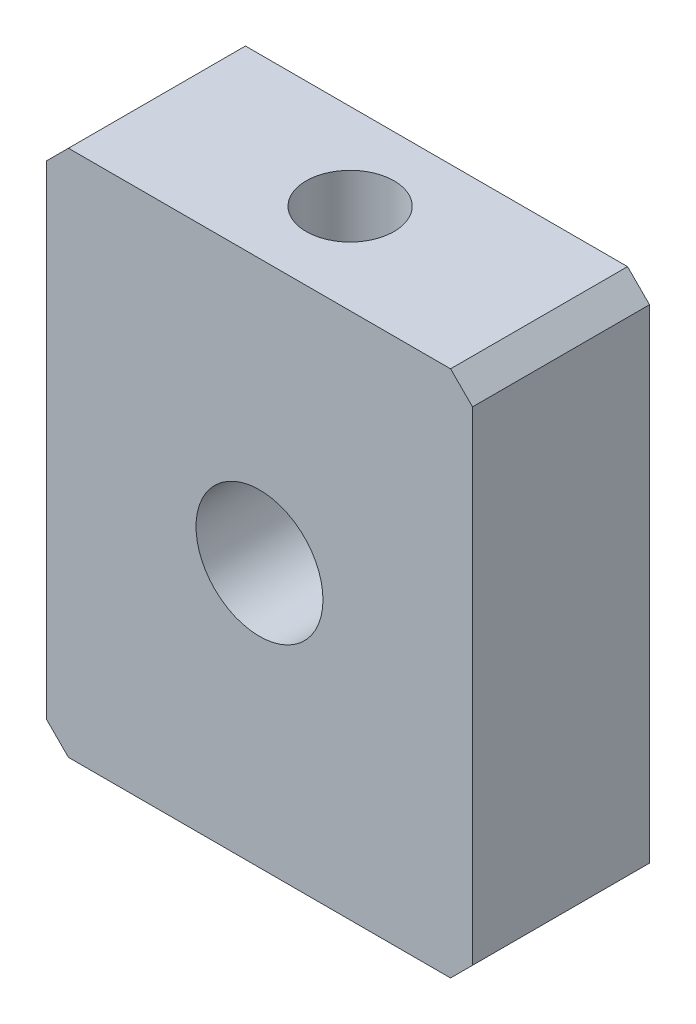
ISO-10303-21;
HEADER;
FILE_DESCRIPTION(('STEP AP214'),'2;1');
FILE_NAME('part.step','',(''),(''),'','','');
FILE_SCHEMA(('AUTOMOTIVE_DESIGN { 1 0 10303 214 1 1 1 1 }'));
ENDSEC;
DATA;
#1=APPLICATION_CONTEXT('core data for automotive mechanical design processes');
#2=APPLICATION_PROTOCOL_DEFINITION('international standard','automotive_design',2000,#1);
#3=PRODUCT_CONTEXT('',#1,'mechanical');
#4=PRODUCT('Part','Part','',(#3));
#5=PRODUCT_RELATED_PRODUCT_CATEGORY('part','',(#4));
#6=PRODUCT_DEFINITION_FORMATION('','',#4);
#7=PRODUCT_DEFINITION_CONTEXT('part definition',#1,'design');
#8=PRODUCT_DEFINITION('design','',#6,#7);
#9=PRODUCT_DEFINITION_SHAPE('','',#8);
#10=(LENGTH_UNIT() NAMED_UNIT(*) SI_UNIT(.MILLI.,.METRE.));
#11=(NAMED_UNIT(*) PLANE_ANGLE_UNIT() SI_UNIT($,.RADIAN.));
#12=(NAMED_UNIT(*) SI_UNIT($,.STERADIAN.) SOLID_ANGLE_UNIT());
#13=UNCERTAINTY_MEASURE_WITH_UNIT(LENGTH_MEASURE(1.E-05),#10,'distance_accuracy_value','');
#14=(GEOMETRIC_REPRESENTATION_CONTEXT(3) GLOBAL_UNCERTAINTY_ASSIGNED_CONTEXT((#13)) GLOBAL_UNIT_ASSIGNED_CONTEXT((#10,
#11,#12)) REPRESENTATION_CONTEXT('',''));
#15=CARTESIAN_POINT('',(0.,0.,0.));
#16=DIRECTION('',(0.,0.,1.));
#17=DIRECTION('',(1.,0.,0.));
#18=AXIS2_PLACEMENT_3D('',#15,#16,#17);
#19=CARTESIAN_POINT('',(164.507410621426,269.013850940292,11.8050675506658));
#20=DIRECTION('',(0.,0.,-1.));
#21=DIRECTION('',(-1.,0.,0.));
#22=AXIS2_PLACEMENT_3D('',#19,#20,#21);
#23=PLANE('',#22);
#24=CARTESIAN_POINT('',(-417.804133345049,371.961966113865,11.8050675506658));
#25=DIRECTION('',(0.,0.,-1.));
#26=DIRECTION('',(-1.,0.,0.));
#27=AXIS2_PLACEMENT_3D('',#24,#25,#26);
#28=CIRCLE('',#27,14.4381275614819);
#29=CARTESIAN_POINT('',(-432.242260906531,371.961966113865,11.8050675506658));
#30=VERTEX_POINT('',#29);
#31=EDGE_CURVE('E248',#30,#30,#28,.T.);
#32=ORIENTED_EDGE('',*,*,#31,.F.);
#33=EDGE_LOOP('',(#32));
#34=FACE_BOUND('',#33,.T.);
#35=DIRECTION('',(1.,0.,0.));
#36=VECTOR('',#35,1.);
#37=CARTESIAN_POINT('',(-466.259133345049,311.961966113865,11.8050675506658));
#38=LINE('',#37,#36);
#39=CARTESIAN_POINT('',(-461.259133345049,311.961966113865,11.8050675506658));
#40=VERTEX_POINT('',#39);
#41=CARTESIAN_POINT('',(-374.349133345049,311.961966113865,11.8050675506658));
#42=VERTEX_POINT('',#41);
#43=EDGE_CURVE('E154',#40,#42,#38,.T.);
#44=ORIENTED_EDGE('',*,*,#43,.F.);
#45=DIRECTION('',(0.707106781186548,-0.707106781186548,0.));
#46=VECTOR('',#45,1.);
#47=CARTESIAN_POINT('',(-126.901803775025,-22.3953634561591,11.8050675506658));
#48=LINE('',#47,#46);
#49=CARTESIAN_POINT('',(-466.259133345049,316.961966113865,11.8050675506658));
#50=VERTEX_POINT('',#49);
#51=EDGE_CURVE('E125',#40,#50,#48,.F.);
#52=ORIENTED_EDGE('',*,*,#51,.T.);
#53=DIRECTION('',(0.,-1.,0.));
#54=VECTOR('',#53,1.);
#55=CARTESIAN_POINT('',(-466.259133345049,311.961966113865,11.8050675506658));
#56=LINE('',#55,#54);
#57=CARTESIAN_POINT('',(-466.259133345049,426.961966113865,11.8050675506658));
#58=VERTEX_POINT('',#57);
#59=EDGE_CURVE('E113',#58,#50,#56,.T.);
#60=ORIENTED_EDGE('',*,*,#59,.F.);
#61=DIRECTION('',(-0.707106781186548,-0.707106781186548,0.));
#62=VECTOR('',#61,1.);
#63=CARTESIAN_POINT('',(-229.849918948598,663.371180510316,11.8050675506658));
#64=LINE('',#63,#62);
#65=CARTESIAN_POINT('',(-461.259133345049,431.961966113865,11.8050675506658));
#66=VERTEX_POINT('',#65);
#67=EDGE_CURVE('E122',#58,#66,#64,.F.);
#68=ORIENTED_EDGE('',*,*,#67,.T.);
#69=DIRECTION('',(-1.,0.,0.));
#70=VECTOR('',#69,1.);
#71=CARTESIAN_POINT('',(-466.259133345049,431.961966113865,11.8050675506658));
#72=LINE('',#71,#70);
#73=CARTESIAN_POINT('',(-374.349133345049,431.961966113865,11.8050675506658));
#74=VERTEX_POINT('',#73);
#75=EDGE_CURVE('E126',#74,#66,#72,.T.);
#76=ORIENTED_EDGE('',*,*,#75,.F.);
#77=DIRECTION('',(-0.707106781186548,0.707106781186548,0.));
#78=VECTOR('',#77,1.);
#79=CARTESIAN_POINT('',(-23.4468037750251,81.0596365438408,11.8050675506658));
#80=LINE('',#79,#78);
#81=CARTESIAN_POINT('',(-369.349133345049,426.961966113865,11.8050675506658));
#82=VERTEX_POINT('',#81);
#83=EDGE_CURVE('E57',#74,#82,#80,.F.);
#84=ORIENTED_EDGE('',*,*,#83,.T.);
#85=DIRECTION('',(0.,1.,0.));
#86=VECTOR('',#85,1.);
#87=CARTESIAN_POINT('',(-369.349133345049,311.961966113865,11.8050675506658));
#88=LINE('',#87,#86);
#89=CARTESIAN_POINT('',(-369.349133345049,316.961966113865,11.8050675506658));
#90=VERTEX_POINT('',#89);
#91=EDGE_CURVE('E158',#90,#82,#88,.T.);
#92=ORIENTED_EDGE('',*,*,#91,.F.);
#93=DIRECTION('',(0.707106781186548,0.707106781186548,0.));
#94=VECTOR('',#93,1.);
#95=CARTESIAN_POINT('',(-126.394918948598,559.916180510316,11.8050675506658));
#96=LINE('',#95,#94);
#97=EDGE_CURVE('E132',#90,#42,#96,.F.);
#98=ORIENTED_EDGE('',*,*,#97,.T.);
#99=EDGE_LOOP('',(#44,#52,#60,#68,#76,#84,#92,#98));
#100=FACE_BOUND('',#99,.T.);
#101=ADVANCED_FACE('F41',(#34,#100),#23,.T.);
#102=CARTESIAN_POINT('',(0.,0.,52.0650675506658));
#103=DIRECTION('',(0.,0.,-1.));
#104=DIRECTION('',(-1.,0.,0.));
#105=AXIS2_PLACEMENT_3D('',#102,#103,#104);
#106=PLANE('',#105);
#107=CARTESIAN_POINT('',(-417.804133345049,371.961966113865,52.0650675506658));
#108=DIRECTION('',(0.,0.,1.));
#109=DIRECTION('',(1.,0.,0.));
#110=AXIS2_PLACEMENT_3D('',#107,#108,#109);
#111=CIRCLE('',#110,14.4381275614819);
#112=CARTESIAN_POINT('',(-403.366005783567,371.961966113865,52.0650675506658));
#113=VERTEX_POINT('',#112);
#114=EDGE_CURVE('E251',#113,#113,#111,.T.);
#115=ORIENTED_EDGE('',*,*,#114,.F.);
#116=EDGE_LOOP('',(#115));
#117=FACE_BOUND('',#116,.T.);
#118=DIRECTION('',(0.,-1.,0.));
#119=VECTOR('',#118,1.);
#120=CARTESIAN_POINT('',(-466.259133345049,311.961966113865,52.0650675506658));
#121=LINE('',#120,#119);
#122=CARTESIAN_POINT('',(-466.259133345049,426.961966113865,52.0650675506658));
#123=VERTEX_POINT('',#122);
#124=CARTESIAN_POINT('',(-466.259133345049,316.961966113865,52.0650675506658));
#125=VERTEX_POINT('',#124);
#126=EDGE_CURVE('E116',#123,#125,#121,.T.);
#127=ORIENTED_EDGE('',*,*,#126,.T.);
#128=DIRECTION('',(-0.707106781186548,0.707106781186548,0.));
#129=VECTOR('',#128,1.);
#130=CARTESIAN_POINT('',(-466.259133345049,316.961966113865,52.0650675506658));
#131=LINE('',#130,#129);
#132=CARTESIAN_POINT('',(-461.259133345049,311.961966113865,52.0650675506658));
#133=VERTEX_POINT('',#132);
#134=EDGE_CURVE('E179',#125,#133,#131,.F.);
#135=ORIENTED_EDGE('',*,*,#134,.T.);
#136=DIRECTION('',(1.,0.,0.));
#137=VECTOR('',#136,1.);
#138=CARTESIAN_POINT('',(-466.259133345049,311.961966113865,52.0650675506658));
#139=LINE('',#138,#137);
#140=CARTESIAN_POINT('',(-374.349133345049,311.961966113865,52.0650675506658));
#141=VERTEX_POINT('',#140);
#142=EDGE_CURVE('E160',#133,#141,#139,.T.);
#143=ORIENTED_EDGE('',*,*,#142,.T.);
#144=DIRECTION('',(-0.707106781186548,-0.707106781186548,0.));
#145=VECTOR('',#144,1.);
#146=CARTESIAN_POINT('',(-374.349133345049,311.961966113865,52.0650675506658));
#147=LINE('',#146,#145);
#148=CARTESIAN_POINT('',(-369.349133345049,316.961966113865,52.0650675506658));
#149=VERTEX_POINT('',#148);
#150=EDGE_CURVE('E177',#141,#149,#147,.F.);
#151=ORIENTED_EDGE('',*,*,#150,.T.);
#152=DIRECTION('',(0.,1.,0.));
#153=VECTOR('',#152,1.);
#154=CARTESIAN_POINT('',(-369.349133345049,311.961966113865,52.0650675506658));
#155=LINE('',#154,#153);
#156=CARTESIAN_POINT('',(-369.349133345049,426.961966113865,52.0650675506658));
#157=VERTEX_POINT('',#156);
#158=EDGE_CURVE('E155',#149,#157,#155,.T.);
#159=ORIENTED_EDGE('',*,*,#158,.T.);
#160=DIRECTION('',(0.707106781186548,-0.707106781186548,0.));
#161=VECTOR('',#160,1.);
#162=CARTESIAN_POINT('',(-369.349133345049,426.961966113865,52.0650675506658));
#163=LINE('',#162,#161);
#164=CARTESIAN_POINT('',(-374.349133345049,431.961966113865,52.0650675506658));
#165=VERTEX_POINT('',#164);
#166=EDGE_CURVE('E153',#157,#165,#163,.F.);
#167=ORIENTED_EDGE('',*,*,#166,.T.);
#168=DIRECTION('',(-1.,0.,0.));
#169=VECTOR('',#168,1.);
#170=CARTESIAN_POINT('',(-466.259133345049,431.961966113865,52.0650675506658));
#171=LINE('',#170,#169);
#172=CARTESIAN_POINT('',(-461.259133345049,431.961966113865,52.0650675506658));
#173=VERTEX_POINT('',#172);
#174=EDGE_CURVE('E147',#165,#173,#171,.T.);
#175=ORIENTED_EDGE('',*,*,#174,.T.);
#176=DIRECTION('',(0.707106781186548,0.707106781186548,0.));
#177=VECTOR('',#176,1.);
#178=CARTESIAN_POINT('',(-461.259133345049,431.961966113865,52.0650675506658));
#179=LINE('',#178,#177);
#180=EDGE_CURVE('E151',#173,#123,#179,.F.);
#181=ORIENTED_EDGE('',*,*,#180,.T.);
#182=EDGE_LOOP('',(#127,#135,#143,#151,#159,#167,#175,#181));
#183=FACE_BOUND('',#182,.T.);
#184=ADVANCED_FACE('F150',(#117,#183),#106,.F.);
#185=CARTESIAN_POINT('',(-466.259133345049,311.961966113865,-142.44002345712));
#186=DIRECTION('',(0.,-1.,0.));
#187=DIRECTION('',(0.,0.,-1.));
#188=AXIS2_PLACEMENT_3D('',#185,#186,#187);
#189=PLANE('',#188);
#190=ORIENTED_EDGE('',*,*,#142,.F.);
#191=DIRECTION('',(0.,0.,-1.));
#192=VECTOR('',#191,1.);
#193=CARTESIAN_POINT('',(-461.259133345049,311.961966113865,-142.44002345712));
#194=LINE('',#193,#192);
#195=EDGE_CURVE('E130',#133,#40,#194,.T.);
#196=ORIENTED_EDGE('',*,*,#195,.T.);
#197=ORIENTED_EDGE('',*,*,#43,.T.);
#198=DIRECTION('',(0.,0.,1.));
#199=VECTOR('',#198,1.);
#200=CARTESIAN_POINT('',(-374.349133345049,311.961966113865,-142.44002345712));
#201=LINE('',#200,#199);
#202=EDGE_CURVE('E134',#42,#141,#201,.T.);
#203=ORIENTED_EDGE('',*,*,#202,.T.);
#204=EDGE_LOOP('',(#190,#196,#197,#203));
#205=FACE_BOUND('',#204,.T.);
#206=ADVANCED_FACE('F184',(#205),#189,.T.);
#207=CARTESIAN_POINT('',(-369.349133345049,311.961966113865,-142.44002345712));
#208=DIRECTION('',(1.,0.,0.));
#209=DIRECTION('',(0.,0.,-1.));
#210=AXIS2_PLACEMENT_3D('',#207,#208,#209);
#211=PLANE('',#210);
#212=ORIENTED_EDGE('',*,*,#158,.F.);
#213=DIRECTION('',(0.,0.,-1.));
#214=VECTOR('',#213,1.);
#215=CARTESIAN_POINT('',(-369.349133345049,316.961966113865,-142.44002345712));
#216=LINE('',#215,#214);
#217=EDGE_CURVE('E64',#149,#90,#216,.T.);
#218=ORIENTED_EDGE('',*,*,#217,.T.);
#219=ORIENTED_EDGE('',*,*,#91,.T.);
#220=DIRECTION('',(0.,0.,1.));
#221=VECTOR('',#220,1.);
#222=CARTESIAN_POINT('',(-369.349133345049,426.961966113865,-142.44002345712));
#223=LINE('',#222,#221);
#224=EDGE_CURVE('E140',#82,#157,#223,.T.);
#225=ORIENTED_EDGE('',*,*,#224,.T.);
#226=EDGE_LOOP('',(#212,#218,#219,#225));
#227=FACE_BOUND('',#226,.T.);
#228=ADVANCED_FACE('F225',(#227),#211,.T.);
#229=CARTESIAN_POINT('',(-466.259133345049,431.961966113865,-142.44002345712));
#230=DIRECTION('',(0.,1.,0.));
#231=DIRECTION('',(0.,0.,1.));
#232=AXIS2_PLACEMENT_3D('',#229,#230,#231);
#233=PLANE('',#232);
#234=CARTESIAN_POINT('',(-417.804133345049,431.961966113865,31.4550675506657));
#235=DIRECTION('',(0.,1.,0.));
#236=DIRECTION('',(0.,0.,1.));
#237=AXIS2_PLACEMENT_3D('',#234,#235,#236);
#238=CIRCLE('',#237,9.9999999999998);
#239=CARTESIAN_POINT('',(-417.804133345049,431.961966113865,21.4550675506659));
#240=VERTEX_POINT('',#239);
#241=EDGE_CURVE('E168',#240,#240,#238,.F.);
#242=ORIENTED_EDGE('',*,*,#241,.T.);
#243=EDGE_LOOP('',(#242));
#244=FACE_BOUND('',#243,.T.);
#245=ORIENTED_EDGE('',*,*,#174,.F.);
#246=DIRECTION('',(0.,0.,-1.));
#247=VECTOR('',#246,1.);
#248=CARTESIAN_POINT('',(-374.349133345049,431.961966113865,-142.44002345712));
#249=LINE('',#248,#247);
#250=EDGE_CURVE('E11',#165,#74,#249,.T.);
#251=ORIENTED_EDGE('',*,*,#250,.T.);
#252=ORIENTED_EDGE('',*,*,#75,.T.);
#253=DIRECTION('',(0.,0.,1.));
#254=VECTOR('',#253,1.);
#255=CARTESIAN_POINT('',(-461.259133345049,431.961966113865,-142.44002345712));
#256=LINE('',#255,#254);
#257=EDGE_CURVE('E50',#66,#173,#256,.T.);
#258=ORIENTED_EDGE('',*,*,#257,.T.);
#259=EDGE_LOOP('',(#245,#251,#252,#258));
#260=FACE_BOUND('',#259,.T.);
#261=ADVANCED_FACE('F146',(#244,#260),#233,.T.);
#262=CARTESIAN_POINT('',(-466.259133345049,311.961966113865,-142.44002345712));
#263=DIRECTION('',(-1.,0.,0.));
#264=DIRECTION('',(0.,0.,1.));
#265=AXIS2_PLACEMENT_3D('',#262,#263,#264);
#266=PLANE('',#265);
#267=ORIENTED_EDGE('',*,*,#59,.T.);
#268=DIRECTION('',(0.,0.,1.));
#269=VECTOR('',#268,1.);
#270=CARTESIAN_POINT('',(-466.259133345049,316.961966113865,-142.44002345712));
#271=LINE('',#270,#269);
#272=EDGE_CURVE('E119',#50,#125,#271,.T.);
#273=ORIENTED_EDGE('',*,*,#272,.T.);
#274=ORIENTED_EDGE('',*,*,#126,.F.);
#275=DIRECTION('',(0.,0.,-1.));
#276=VECTOR('',#275,1.);
#277=CARTESIAN_POINT('',(-466.259133345049,426.961966113865,-142.44002345712));
#278=LINE('',#277,#276);
#279=EDGE_CURVE('E109',#123,#58,#278,.T.);
#280=ORIENTED_EDGE('',*,*,#279,.T.);
#281=EDGE_LOOP('',(#267,#273,#274,#280));
#282=FACE_BOUND('',#281,.T.);
#283=ADVANCED_FACE('F111',(#282),#266,.T.);
#284=CARTESIAN_POINT('',(-417.804133345049,431.961978113865,31.4550675506657));
#285=DIRECTION('',(0.,-1.,0.));
#286=DIRECTION('',(0.,0.,-1.));
#287=AXIS2_PLACEMENT_3D('',#284,#285,#286);
#288=CYLINDRICAL_SURFACE('',#287,9.9999999999998);
#289=CARTESIAN_POINT('',(-417.804133345049,411.961966113865,31.4550675506657));
#290=DIRECTION('',(0.,1.,0.));
#291=DIRECTION('',(0.,0.,1.));
#292=AXIS2_PLACEMENT_3D('',#289,#290,#291);
#293=CIRCLE('',#292,9.9999999999998);
#294=CARTESIAN_POINT('',(-417.804133345049,411.961966113865,21.4550675506659));
#295=VERTEX_POINT('',#294);
#296=EDGE_CURVE('E163',#295,#295,#293,.T.);
#297=CARTESIAN_POINT('',(-417.804133345049,431.961966113865,21.4550675506659));
#298=CARTESIAN_POINT('',(-417.804133345049,431.753632780531,21.4550675506659));
#299=CARTESIAN_POINT('',(-417.804133345049,431.545299447198,21.4550675506659));
#300=CARTESIAN_POINT('',(-417.804133345049,431.128632780531,21.4550675506659));
#301=CARTESIAN_POINT('',(-417.804133345049,430.920299447198,21.4550675506659));
#302=CARTESIAN_POINT('',(-417.804133345049,430.503632780532,21.4550675506659));
#303=CARTESIAN_POINT('',(-417.804133345049,430.295299447198,21.4550675506659));
#304=CARTESIAN_POINT('',(-417.804133345049,429.878632780531,21.4550675506659));
#305=CARTESIAN_POINT('',(-417.804133345049,429.670299447198,21.4550675506659));
#306=CARTESIAN_POINT('',(-417.804133345049,429.253632780531,21.4550675506659));
#307=CARTESIAN_POINT('',(-417.804133345049,429.045299447198,21.4550675506659));
#308=CARTESIAN_POINT('',(-417.804133345049,428.628632780531,21.4550675506659));
#309=CARTESIAN_POINT('',(-417.804133345049,428.420299447198,21.4550675506659));
#310=CARTESIAN_POINT('',(-417.804133345049,428.003632780532,21.4550675506659));
#311=CARTESIAN_POINT('',(-417.804133345049,427.795299447198,21.4550675506659));
#312=CARTESIAN_POINT('',(-417.804133345049,427.378632780531,21.4550675506659));
#313=CARTESIAN_POINT('',(-417.804133345049,427.170299447198,21.4550675506659));
#314=CARTESIAN_POINT('',(-417.804133345049,426.753632780531,21.4550675506659));
#315=CARTESIAN_POINT('',(-417.804133345049,426.545299447198,21.4550675506659));
#316=CARTESIAN_POINT('',(-417.804133345049,426.128632780531,21.4550675506659));
#317=CARTESIAN_POINT('',(-417.804133345049,425.920299447198,21.4550675506659));
#318=CARTESIAN_POINT('',(-417.804133345049,425.503632780532,21.4550675506659));
#319=CARTESIAN_POINT('',(-417.804133345049,425.295299447198,21.4550675506659));
#320=CARTESIAN_POINT('',(-417.804133345049,424.878632780531,21.4550675506659));
#321=CARTESIAN_POINT('',(-417.804133345049,424.670299447198,21.4550675506659));
#322=CARTESIAN_POINT('',(-417.804133345049,424.253632780531,21.4550675506659));
#323=CARTESIAN_POINT('',(-417.804133345049,424.045299447198,21.4550675506659));
#324=CARTESIAN_POINT('',(-417.804133345049,423.628632780531,21.4550675506659));
#325=CARTESIAN_POINT('',(-417.804133345049,423.420299447198,21.4550675506659));
#326=CARTESIAN_POINT('',(-417.804133345049,423.003632780532,21.4550675506659));
#327=CARTESIAN_POINT('',(-417.804133345049,422.795299447198,21.4550675506659));
#328=CARTESIAN_POINT('',(-417.804133345049,422.378632780531,21.4550675506659));
#329=CARTESIAN_POINT('',(-417.804133345049,422.170299447198,21.4550675506659));
#330=CARTESIAN_POINT('',(-417.804133345049,421.753632780531,21.4550675506659));
#331=CARTESIAN_POINT('',(-417.804133345049,421.545299447198,21.4550675506659));
#332=CARTESIAN_POINT('',(-417.804133345049,421.128632780531,21.4550675506659));
#333=CARTESIAN_POINT('',(-417.804133345049,420.920299447198,21.4550675506659));
#334=CARTESIAN_POINT('',(-417.804133345049,420.503632780531,21.4550675506659));
#335=CARTESIAN_POINT('',(-417.804133345049,420.295299447198,21.4550675506659));
#336=CARTESIAN_POINT('',(-417.804133345049,419.878632780531,21.4550675506659));
#337=CARTESIAN_POINT('',(-417.804133345049,419.670299447198,21.4550675506659));
#338=CARTESIAN_POINT('',(-417.804133345049,419.253632780531,21.4550675506659));
#339=CARTESIAN_POINT('',(-417.804133345049,419.045299447198,21.4550675506659));
#340=CARTESIAN_POINT('',(-417.804133345049,418.628632780531,21.4550675506659));
#341=CARTESIAN_POINT('',(-417.804133345049,418.420299447198,21.4550675506659));
#342=CARTESIAN_POINT('',(-417.804133345049,418.003632780531,21.4550675506659));
#343=CARTESIAN_POINT('',(-417.804133345049,417.795299447198,21.4550675506659));
#344=CARTESIAN_POINT('',(-417.804133345049,417.378632780531,21.4550675506659));
#345=CARTESIAN_POINT('',(-417.804133345049,417.170299447198,21.4550675506659));
#346=CARTESIAN_POINT('',(-417.804133345049,416.753632780531,21.4550675506659));
#347=CARTESIAN_POINT('',(-417.804133345049,416.545299447198,21.4550675506659));
#348=CARTESIAN_POINT('',(-417.804133345049,416.128632780531,21.4550675506659));
#349=CARTESIAN_POINT('',(-417.804133345049,415.920299447198,21.4550675506659));
#350=CARTESIAN_POINT('',(-417.804133345049,415.503632780531,21.4550675506659));
#351=CARTESIAN_POINT('',(-417.804133345049,415.295299447198,21.4550675506659));
#352=CARTESIAN_POINT('',(-417.804133345049,414.878632780531,21.4550675506659));
#353=CARTESIAN_POINT('',(-417.804133345049,414.670299447198,21.4550675506659));
#354=CARTESIAN_POINT('',(-417.804133345049,414.253632780531,21.4550675506659));
#355=CARTESIAN_POINT('',(-417.804133345049,414.045299447198,21.4550675506659));
#356=CARTESIAN_POINT('',(-417.804133345049,413.628632780531,21.4550675506659));
#357=CARTESIAN_POINT('',(-417.804133345049,413.420299447198,21.4550675506659));
#358=CARTESIAN_POINT('',(-417.804133345049,413.003632780531,21.4550675506659));
#359=CARTESIAN_POINT('',(-417.804133345049,412.795299447198,21.4550675506659));
#360=CARTESIAN_POINT('',(-417.804133345049,412.378632780531,21.4550675506659));
#361=CARTESIAN_POINT('',(-417.804133345049,412.170299447198,21.4550675506659));
#362=CARTESIAN_POINT('',(-417.804133345049,411.961966113865,21.4550675506659));
#363=B_SPLINE_CURVE_WITH_KNOTS('',3,(#297,#298,#299,#300,#301,#302,#303,#304,#305,#306,#307,
#308,#309,#310,#311,#312,#313,#314,#315,#316,#317,#318,#319,#320,#321,#322,#323,#324,#325,#326,
#327,#328,#329,#330,#331,#332,#333,#334,#335,#336,#337,#338,#339,#340,#341,#342,#343,#344,#345,
#346,#347,#348,#349,#350,#351,#352,#353,#354,#355,#356,#357,#358,#359,#360,#361,#362),
.UNSPECIFIED.,.F.,.F.,(4,2,2,2,2,2,2,2,2,2,2,2,2,2,2,2,2,2,2,2,2,2,2,2,2,2,2,2,2,2,2,2,4),(0.,
0.624999999999987,1.24999999999997,1.87499999999996,2.5,3.12499999999999,3.74999999999998,
4.37499999999996,5.,5.62499999999999,6.24999999999998,6.87499999999996,7.50000000000001,
8.12499999999999,8.74999999999998,9.37499999999997,10.,10.625,11.25,11.875,12.5,13.125,13.75,
14.375,15.,15.625,16.25,16.875,17.5,18.125,18.75,19.375,20.),.UNSPECIFIED.);
#364=EDGE_CURVE('BSEAM232',#240,#295,#363,.T.);
#365=ORIENTED_EDGE('',*,*,#241,.F.);
#366=ORIENTED_EDGE('',*,*,#296,.F.);
#367=ORIENTED_EDGE('',*,*,#364,.T.);
#368=ORIENTED_EDGE('',*,*,#364,.F.);
#369=EDGE_LOOP('',(#365,#367,#366,#368));
#370=FACE_BOUND('',#369,.T.);
#371=ADVANCED_FACE('F232',(#370),#288,.F.);
#372=CARTESIAN_POINT('',(-417.804133345049,411.961966113865,31.4550675506657));
#373=DIRECTION('',(0.,1.,0.));
#374=DIRECTION('',(0.,0.,1.));
#375=AXIS2_PLACEMENT_3D('',#372,#373,#374);
#376=PLANE('',#375);
#377=ORIENTED_EDGE('',*,*,#296,.T.);
#378=EDGE_LOOP('',(#377));
#379=FACE_BOUND('',#378,.T.);
#380=ADVANCED_FACE('F199',(#379),#376,.T.);
#381=CARTESIAN_POINT('',(-466.259133345049,316.961966113865,-142.44002345712));
#382=DIRECTION('',(0.707106781186547,0.707106781186547,0.));
#383=DIRECTION('',(0.,0.,1.));
#384=AXIS2_PLACEMENT_3D('',#381,#382,#383);
#385=PLANE('',#384);
#386=ORIENTED_EDGE('',*,*,#51,.F.);
#387=ORIENTED_EDGE('',*,*,#195,.F.);
#388=ORIENTED_EDGE('',*,*,#134,.F.);
#389=ORIENTED_EDGE('',*,*,#272,.F.);
#390=EDGE_LOOP('',(#386,#387,#388,#389));
#391=FACE_BOUND('',#390,.T.);
#392=ADVANCED_FACE('F189',(#391),#385,.F.);
#393=CARTESIAN_POINT('',(-374.349133345049,311.961966113865,-142.44002345712));
#394=DIRECTION('',(-0.707106781186547,0.707106781186547,0.));
#395=DIRECTION('',(0.,0.,1.));
#396=AXIS2_PLACEMENT_3D('',#393,#394,#395);
#397=PLANE('',#396);
#398=ORIENTED_EDGE('',*,*,#97,.F.);
#399=ORIENTED_EDGE('',*,*,#217,.F.);
#400=ORIENTED_EDGE('',*,*,#150,.F.);
#401=ORIENTED_EDGE('',*,*,#202,.F.);
#402=EDGE_LOOP('',(#398,#399,#400,#401));
#403=FACE_BOUND('',#402,.T.);
#404=ADVANCED_FACE('F190',(#403),#397,.F.);
#405=CARTESIAN_POINT('',(-369.349133345049,426.961966113865,-142.44002345712));
#406=DIRECTION('',(-0.707106781186547,-0.707106781186547,0.));
#407=DIRECTION('',(0.,0.,1.));
#408=AXIS2_PLACEMENT_3D('',#405,#406,#407);
#409=PLANE('',#408);
#410=ORIENTED_EDGE('',*,*,#83,.F.);
#411=ORIENTED_EDGE('',*,*,#250,.F.);
#412=ORIENTED_EDGE('',*,*,#166,.F.);
#413=ORIENTED_EDGE('',*,*,#224,.F.);
#414=EDGE_LOOP('',(#410,#411,#412,#413));
#415=FACE_BOUND('',#414,.T.);
#416=ADVANCED_FACE('F192',(#415),#409,.F.);
#417=CARTESIAN_POINT('',(-461.259133345049,431.961966113865,-142.44002345712));
#418=DIRECTION('',(0.707106781186547,-0.707106781186547,0.));
#419=DIRECTION('',(0.,0.,1.));
#420=AXIS2_PLACEMENT_3D('',#417,#418,#419);
#421=PLANE('',#420);
#422=ORIENTED_EDGE('',*,*,#67,.F.);
#423=ORIENTED_EDGE('',*,*,#279,.F.);
#424=ORIENTED_EDGE('',*,*,#180,.F.);
#425=ORIENTED_EDGE('',*,*,#257,.F.);
#426=EDGE_LOOP('',(#422,#423,#424,#425));
#427=FACE_BOUND('',#426,.T.);
#428=ADVANCED_FACE('F44',(#427),#421,.F.);
#429=CARTESIAN_POINT('',(-417.804133345049,371.961966113865,-447.934932449334));
#430=DIRECTION('',(0.,0.,1.));
#431=DIRECTION('',(1.,0.,0.));
#432=AXIS2_PLACEMENT_3D('',#429,#430,#431);
#433=CYLINDRICAL_SURFACE('',#432,14.4381275614819);
#434=ORIENTED_EDGE('',*,*,#31,.T.);
#435=EDGE_LOOP('',(#434));
#436=FACE_BOUND('',#435,.T.);
#437=ORIENTED_EDGE('',*,*,#114,.T.);
#438=EDGE_LOOP('',(#437));
#439=FACE_BOUND('',#438,.T.);
#440=ADVANCED_FACE('F240',(#436,#439),#433,.F.);
#441=CLOSED_SHELL('',(#101,#184,#206,#228,#261,#283,#371,#380,#392,#404,#416,#428,#440));
#442=MANIFOLD_SOLID_BREP('B2',#441);
#443=ADVANCED_BREP_SHAPE_REPRESENTATION('',(#18,#442),#14);
#444=SHAPE_DEFINITION_REPRESENTATION(#9,#443);
ENDSEC;
END-ISO-10303-21;
